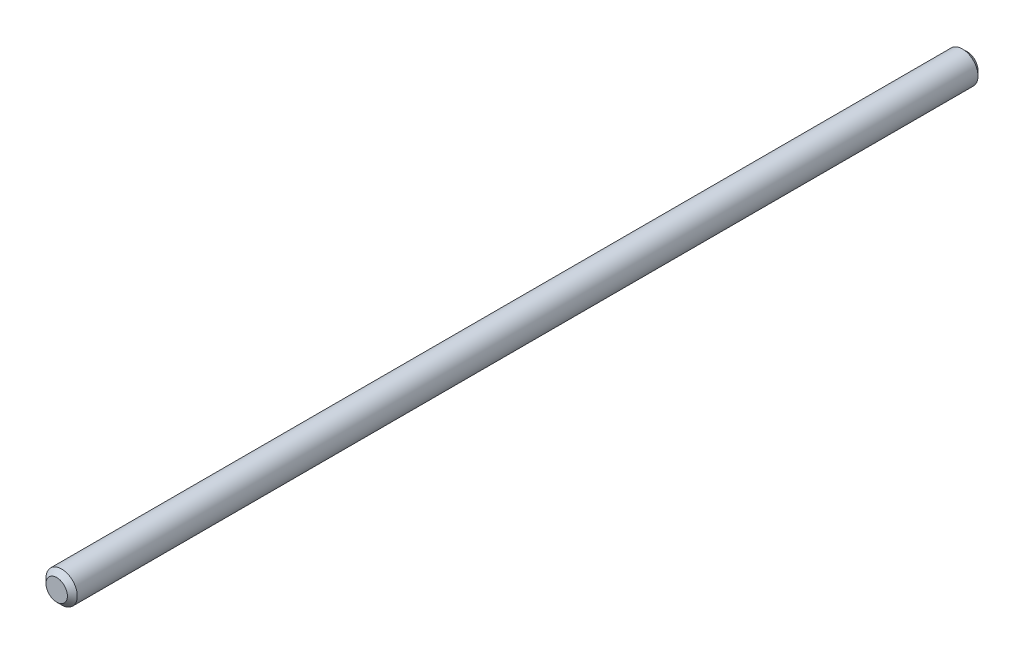
ISO-10303-21;
HEADER;
FILE_DESCRIPTION(('STEP AP214'),'2;1');
FILE_NAME('part.step','',(''),(''),'','','');
FILE_SCHEMA(('AUTOMOTIVE_DESIGN { 1 0 10303 214 1 1 1 1 }'));
ENDSEC;
DATA;
#1=APPLICATION_CONTEXT('core data for automotive mechanical design processes');
#2=APPLICATION_PROTOCOL_DEFINITION('international standard','automotive_design',2000,#1);
#3=PRODUCT_CONTEXT('',#1,'mechanical');
#4=PRODUCT('Part','Part','',(#3));
#5=PRODUCT_RELATED_PRODUCT_CATEGORY('part','',(#4));
#6=PRODUCT_DEFINITION_FORMATION('','',#4);
#7=PRODUCT_DEFINITION_CONTEXT('part definition',#1,'design');
#8=PRODUCT_DEFINITION('design','',#6,#7);
#9=PRODUCT_DEFINITION_SHAPE('','',#8);
#10=(LENGTH_UNIT() NAMED_UNIT(*) SI_UNIT(.MILLI.,.METRE.));
#11=(NAMED_UNIT(*) PLANE_ANGLE_UNIT() SI_UNIT($,.RADIAN.));
#12=(NAMED_UNIT(*) SI_UNIT($,.STERADIAN.) SOLID_ANGLE_UNIT());
#13=UNCERTAINTY_MEASURE_WITH_UNIT(LENGTH_MEASURE(1.E-05),#10,'distance_accuracy_value','');
#14=(GEOMETRIC_REPRESENTATION_CONTEXT(3) GLOBAL_UNCERTAINTY_ASSIGNED_CONTEXT((#13)) GLOBAL_UNIT_ASSIGNED_CONTEXT((#10,
#11,#12)) REPRESENTATION_CONTEXT('',''));
#15=CARTESIAN_POINT('',(0.,0.,0.));
#16=DIRECTION('',(0.,0.,1.));
#17=DIRECTION('',(1.,0.,0.));
#18=AXIS2_PLACEMENT_3D('',#15,#16,#17);
#19=CARTESIAN_POINT('',(0.,0.,-185.));
#20=DIRECTION('',(0.,0.,1.));
#21=DIRECTION('',(1.,0.,0.));
#22=AXIS2_PLACEMENT_3D('',#19,#20,#21);
#23=CYLINDRICAL_SURFACE('',#22,3.175);
#24=CARTESIAN_POINT('',(0.,0.,-184.));
#25=DIRECTION('',(0.,0.,1.));
#26=DIRECTION('',(1.,0.,0.));
#27=AXIS2_PLACEMENT_3D('',#24,#25,#26);
#28=CIRCLE('',#27,3.175);
#29=CARTESIAN_POINT('',(3.175,0.,-184.));
#30=VERTEX_POINT('',#29);
#31=EDGE_CURVE('E59',#30,#30,#28,.T.);
#32=ORIENTED_EDGE('',*,*,#31,.T.);
#33=EDGE_LOOP('',(#32));
#34=FACE_BOUND('',#33,.T.);
#35=CARTESIAN_POINT('',(0.,0.,-1.));
#36=DIRECTION('',(0.,0.,1.));
#37=DIRECTION('',(1.,0.,0.));
#38=AXIS2_PLACEMENT_3D('',#35,#36,#37);
#39=CIRCLE('',#38,3.175);
#40=CARTESIAN_POINT('',(3.175,0.,-1.));
#41=VERTEX_POINT('',#40);
#42=EDGE_CURVE('E63',#41,#41,#39,.F.);
#43=ORIENTED_EDGE('',*,*,#42,.T.);
#44=EDGE_LOOP('',(#43));
#45=FACE_BOUND('',#44,.T.);
#46=ADVANCED_FACE('F48',(#34,#45),#23,.T.);
#47=CARTESIAN_POINT('',(0.,0.,-185.));
#48=DIRECTION('',(0.,0.,1.));
#49=DIRECTION('',(1.,0.,0.));
#50=AXIS2_PLACEMENT_3D('',#47,#48,#49);
#51=PLANE('',#50);
#52=CARTESIAN_POINT('',(0.,0.,-185.));
#53=DIRECTION('',(0.,0.,1.));
#54=DIRECTION('',(1.,0.,0.));
#55=AXIS2_PLACEMENT_3D('',#52,#53,#54);
#56=CIRCLE('',#55,2.17500000000001);
#57=CARTESIAN_POINT('',(2.17500000000001,0.,-185.));
#58=VERTEX_POINT('',#57);
#59=EDGE_CURVE('E55',#58,#58,#56,.F.);
#60=ORIENTED_EDGE('',*,*,#59,.T.);
#61=EDGE_LOOP('',(#60));
#62=FACE_BOUND('',#61,.T.);
#63=ADVANCED_FACE('F79',(#62),#51,.F.);
#64=CARTESIAN_POINT('',(0.,0.,0.));
#65=DIRECTION('',(0.,0.,1.));
#66=DIRECTION('',(1.,0.,0.));
#67=AXIS2_PLACEMENT_3D('',#64,#65,#66);
#68=PLANE('',#67);
#69=CARTESIAN_POINT('',(0.,0.,0.));
#70=DIRECTION('',(0.,0.,1.));
#71=DIRECTION('',(1.,0.,0.));
#72=AXIS2_PLACEMENT_3D('',#69,#70,#71);
#73=CIRCLE('',#72,2.17500000000001);
#74=CARTESIAN_POINT('',(2.17500000000001,0.,0.));
#75=VERTEX_POINT('',#74);
#76=EDGE_CURVE('E12',#75,#75,#73,.T.);
#77=ORIENTED_EDGE('',*,*,#76,.T.);
#78=EDGE_LOOP('',(#77));
#79=FACE_BOUND('',#78,.T.);
#80=ADVANCED_FACE('F76',(#79),#68,.T.);
#81=CARTESIAN_POINT('',(0.,0.,-184.));
#82=DIRECTION('',(0.,0.,1.));
#83=DIRECTION('',(1.,0.,0.));
#84=AXIS2_PLACEMENT_3D('',#81,#82,#83);
#85=CONICAL_SURFACE('',#84,3.175,0.785398163397443);
#86=ORIENTED_EDGE('',*,*,#59,.F.);
#87=EDGE_LOOP('',(#86));
#88=FACE_BOUND('',#87,.T.);
#89=ORIENTED_EDGE('',*,*,#31,.F.);
#90=EDGE_LOOP('',(#89));
#91=FACE_BOUND('',#90,.T.);
#92=ADVANCED_FACE('F72',(#88,#91),#85,.T.);
#93=CARTESIAN_POINT('',(0.,0.,0.));
#94=DIRECTION('',(0.,0.,-1.));
#95=DIRECTION('',(-1.,0.,0.));
#96=AXIS2_PLACEMENT_3D('',#93,#94,#95);
#97=CONICAL_SURFACE('',#96,2.17500000000001,0.785398163397443);
#98=ORIENTED_EDGE('',*,*,#42,.F.);
#99=EDGE_LOOP('',(#98));
#100=FACE_BOUND('',#99,.T.);
#101=ORIENTED_EDGE('',*,*,#76,.F.);
#102=EDGE_LOOP('',(#101));
#103=FACE_BOUND('',#102,.T.);
#104=ADVANCED_FACE('F50',(#100,#103),#97,.T.);
#105=CLOSED_SHELL('',(#46,#63,#80,#92,#104));
#106=MANIFOLD_SOLID_BREP('B2',#105);
#107=ADVANCED_BREP_SHAPE_REPRESENTATION('',(#18,#106),#14);
#108=SHAPE_DEFINITION_REPRESENTATION(#9,#107);
ENDSEC;
END-ISO-10303-21;
